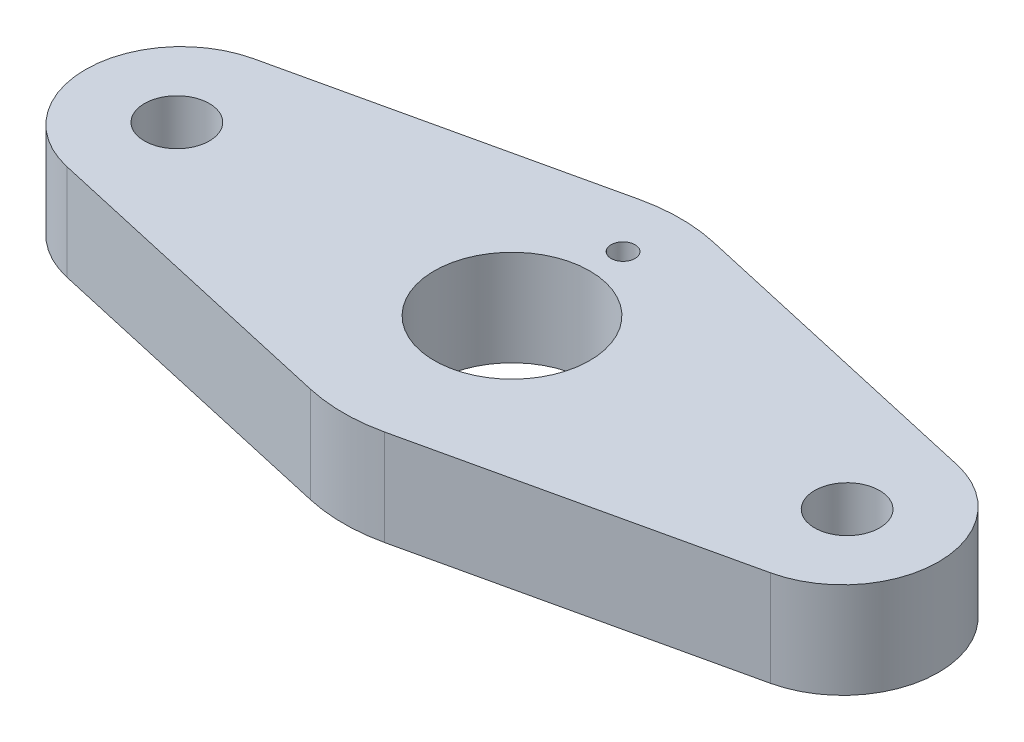
ISO-10303-21;
HEADER;
FILE_DESCRIPTION(('STEP AP214'),'2;1');
FILE_NAME('part.step','',(''),(''),'','','');
FILE_SCHEMA(('AUTOMOTIVE_DESIGN { 1 0 10303 214 1 1 1 1 }'));
ENDSEC;
DATA;
#1=APPLICATION_CONTEXT('core data for automotive mechanical design processes');
#2=APPLICATION_PROTOCOL_DEFINITION('international standard','automotive_design',2000,#1);
#3=PRODUCT_CONTEXT('',#1,'mechanical');
#4=PRODUCT('Part','Part','',(#3));
#5=PRODUCT_RELATED_PRODUCT_CATEGORY('part','',(#4));
#6=PRODUCT_DEFINITION_FORMATION('','',#4);
#7=PRODUCT_DEFINITION_CONTEXT('part definition',#1,'design');
#8=PRODUCT_DEFINITION('design','',#6,#7);
#9=PRODUCT_DEFINITION_SHAPE('','',#8);
#10=(LENGTH_UNIT() NAMED_UNIT(*) SI_UNIT(.MILLI.,.METRE.));
#11=(NAMED_UNIT(*) PLANE_ANGLE_UNIT() SI_UNIT($,.RADIAN.));
#12=(NAMED_UNIT(*) SI_UNIT($,.STERADIAN.) SOLID_ANGLE_UNIT());
#13=UNCERTAINTY_MEASURE_WITH_UNIT(LENGTH_MEASURE(1.E-05),#10,'distance_accuracy_value','');
#14=(GEOMETRIC_REPRESENTATION_CONTEXT(3) GLOBAL_UNCERTAINTY_ASSIGNED_CONTEXT((#13)) GLOBAL_UNIT_ASSIGNED_CONTEXT((#10,
#11,#12)) REPRESENTATION_CONTEXT('',''));
#15=CARTESIAN_POINT('',(0.,0.,0.));
#16=DIRECTION('',(0.,0.,1.));
#17=DIRECTION('',(1.,0.,0.));
#18=AXIS2_PLACEMENT_3D('',#15,#16,#17);
#19=CARTESIAN_POINT('',(21.9363636363636,0.,0.));
#20=DIRECTION('',(0.,1.,0.));
#21=DIRECTION('',(0.,0.,1.));
#22=AXIS2_PLACEMENT_3D('',#19,#20,#21);
#23=PLANE('',#22);
#24=CARTESIAN_POINT('',(22.225,0.,0.));
#25=DIRECTION('',(0.,-1.,0.));
#26=DIRECTION('',(0.,0.,-1.));
#27=AXIS2_PLACEMENT_3D('',#24,#25,#26);
#28=CIRCLE('',#27,2.15265000000001);
#29=CARTESIAN_POINT('',(22.225,0.,-2.15265000000001));
#30=VERTEX_POINT('',#29);
#31=EDGE_CURVE('E104',#30,#30,#28,.F.);
#32=ORIENTED_EDGE('',*,*,#31,.T.);
#33=EDGE_LOOP('',(#32));
#34=FACE_BOUND('',#33,.T.);
#35=CARTESIAN_POINT('',(-22.225,0.,0.));
#36=DIRECTION('',(0.,-1.,0.));
#37=DIRECTION('',(0.,0.,-1.));
#38=AXIS2_PLACEMENT_3D('',#35,#36,#37);
#39=CIRCLE('',#38,2.15265000000001);
#40=CARTESIAN_POINT('',(-22.225,0.,-2.15265000000001));
#41=VERTEX_POINT('',#40);
#42=EDGE_CURVE('E101',#41,#41,#39,.F.);
#43=ORIENTED_EDGE('',*,*,#42,.T.);
#44=EDGE_LOOP('',(#43));
#45=FACE_BOUND('',#44,.T.);
#46=DIRECTION('',(-0.975499871860576,0.,0.22));
#47=VECTOR('',#46,1.);
#48=CARTESIAN_POINT('',(23.3333636363632,0.,6.19442418631476));
#49=LINE('',#48,#47);
#50=CARTESIAN_POINT('',(23.3333636363634,0.,6.19442418631471));
#51=VERTEX_POINT('',#50);
#52=CARTESIAN_POINT('',(2.45872,0.,10.9021865679138));
#53=VERTEX_POINT('',#52);
#54=EDGE_CURVE('E84',#51,#53,#49,.T.);
#55=ORIENTED_EDGE('',*,*,#54,.T.);
#56=CARTESIAN_POINT('',(0.,0.,0.));
#57=DIRECTION('',(0.,-1.,0.));
#58=DIRECTION('',(0.,0.,-1.));
#59=AXIS2_PLACEMENT_3D('',#56,#57,#58);
#60=CIRCLE('',#59,11.176);
#61=CARTESIAN_POINT('',(-2.45872,0.,10.9021865679138));
#62=VERTEX_POINT('',#61);
#63=EDGE_CURVE('E112',#62,#53,#60,.F.);
#64=ORIENTED_EDGE('',*,*,#63,.F.);
#65=DIRECTION('',(-0.975499871860576,0.,-0.22));
#66=VECTOR('',#65,1.);
#67=CARTESIAN_POINT('',(-23.3333636363632,0.,6.19442418631476));
#68=LINE('',#67,#66);
#69=CARTESIAN_POINT('',(-23.3333636363634,0.,6.19442418631471));
#70=VERTEX_POINT('',#69);
#71=EDGE_CURVE('E109',#62,#70,#68,.T.);
#72=ORIENTED_EDGE('',*,*,#71,.T.);
#73=CARTESIAN_POINT('',(-21.9363636363636,0.,0.));
#74=DIRECTION('',(0.,-1.,0.));
#75=DIRECTION('',(0.,0.,-1.));
#76=AXIS2_PLACEMENT_3D('',#73,#74,#75);
#77=CIRCLE('',#76,6.35);
#78=CARTESIAN_POINT('',(-23.3333636363634,0.,-6.1944241863147));
#79=VERTEX_POINT('',#78);
#80=EDGE_CURVE('E117',#79,#70,#77,.F.);
#81=ORIENTED_EDGE('',*,*,#80,.F.);
#82=DIRECTION('',(0.975499871860576,0.,-0.22));
#83=VECTOR('',#82,1.);
#84=CARTESIAN_POINT('',(-23.3333636363632,0.,-6.19442418631475));
#85=LINE('',#84,#83);
#86=CARTESIAN_POINT('',(-2.45872,0.,-10.9021865679138));
#87=VERTEX_POINT('',#86);
#88=EDGE_CURVE('E114',#79,#87,#85,.T.);
#89=ORIENTED_EDGE('',*,*,#88,.T.);
#90=CARTESIAN_POINT('',(0.,0.,0.));
#91=DIRECTION('',(0.,-1.,0.));
#92=DIRECTION('',(0.,0.,-1.));
#93=AXIS2_PLACEMENT_3D('',#90,#91,#92);
#94=CIRCLE('',#93,11.176);
#95=CARTESIAN_POINT('',(2.45872,0.,-10.9021865679138));
#96=VERTEX_POINT('',#95);
#97=EDGE_CURVE('E148',#96,#87,#94,.F.);
#98=ORIENTED_EDGE('',*,*,#97,.F.);
#99=DIRECTION('',(0.975499871860576,0.,0.22));
#100=VECTOR('',#99,1.);
#101=CARTESIAN_POINT('',(23.3333636363632,0.,-6.19442418631475));
#102=LINE('',#101,#100);
#103=CARTESIAN_POINT('',(23.3333636363634,0.,-6.1944241863147));
#104=VERTEX_POINT('',#103);
#105=EDGE_CURVE('E86',#96,#104,#102,.T.);
#106=ORIENTED_EDGE('',*,*,#105,.T.);
#107=CARTESIAN_POINT('',(21.9363636363636,0.,0.));
#108=DIRECTION('',(0.,-1.,0.));
#109=DIRECTION('',(0.,0.,-1.));
#110=AXIS2_PLACEMENT_3D('',#107,#108,#109);
#111=CIRCLE('',#110,6.35);
#112=EDGE_CURVE('E80',#51,#104,#111,.F.);
#113=ORIENTED_EDGE('',*,*,#112,.F.);
#114=EDGE_LOOP('',(#55,#64,#72,#81,#89,#98,#106,#113));
#115=FACE_BOUND('',#114,.T.);
#116=CARTESIAN_POINT('',(0.,0.,0.));
#117=DIRECTION('',(0.,-1.,0.));
#118=DIRECTION('',(0.,0.,-1.));
#119=AXIS2_PLACEMENT_3D('',#116,#117,#118);
#120=CIRCLE('',#119,5.1562);
#121=CARTESIAN_POINT('',(0.,0.,-5.1562));
#122=VERTEX_POINT('',#121);
#123=EDGE_CURVE('E90',#122,#122,#120,.F.);
#124=ORIENTED_EDGE('',*,*,#123,.T.);
#125=EDGE_LOOP('',(#124));
#126=FACE_BOUND('',#125,.T.);
#127=CARTESIAN_POINT('',(0.,0.,-7.366));
#128=DIRECTION('',(0.,-1.,0.));
#129=DIRECTION('',(0.,0.,-1.));
#130=AXIS2_PLACEMENT_3D('',#127,#128,#129);
#131=CIRCLE('',#130,0.793749999999999);
#132=CARTESIAN_POINT('',(0.,0.,-8.15975));
#133=VERTEX_POINT('',#132);
#134=EDGE_CURVE('E20',#133,#133,#131,.F.);
#135=ORIENTED_EDGE('',*,*,#134,.T.);
#136=EDGE_LOOP('',(#135));
#137=FACE_BOUND('',#136,.T.);
#138=ADVANCED_FACE('F17',(#34,#45,#115,#126,#137),#23,.F.);
#139=CARTESIAN_POINT('',(0.,6.35,-7.366));
#140=DIRECTION('',(0.,-1.,0.));
#141=DIRECTION('',(0.,0.,-1.));
#142=AXIS2_PLACEMENT_3D('',#139,#140,#141);
#143=CYLINDRICAL_SURFACE('',#142,0.793749999999999);
#144=CARTESIAN_POINT('',(0.,6.35,-7.366));
#145=DIRECTION('',(0.,-1.,0.));
#146=DIRECTION('',(0.,0.,-1.));
#147=AXIS2_PLACEMENT_3D('',#144,#145,#146);
#148=CIRCLE('',#147,0.793749999999999);
#149=CARTESIAN_POINT('',(0.,6.35,-8.15975));
#150=VERTEX_POINT('',#149);
#151=EDGE_CURVE('E139',#150,#150,#148,.T.);
#152=ORIENTED_EDGE('',*,*,#151,.F.);
#153=EDGE_LOOP('',(#152));
#154=FACE_BOUND('',#153,.T.);
#155=ORIENTED_EDGE('',*,*,#134,.F.);
#156=EDGE_LOOP('',(#155));
#157=FACE_BOUND('',#156,.T.);
#158=ADVANCED_FACE('F155',(#154,#157),#143,.F.);
#159=CARTESIAN_POINT('',(0.,6.35,0.));
#160=DIRECTION('',(0.,-1.,0.));
#161=DIRECTION('',(0.,0.,-1.));
#162=AXIS2_PLACEMENT_3D('',#159,#160,#161);
#163=CYLINDRICAL_SURFACE('',#162,5.1562);
#164=CARTESIAN_POINT('',(0.,6.35,0.));
#165=DIRECTION('',(0.,-1.,0.));
#166=DIRECTION('',(0.,0.,-1.));
#167=AXIS2_PLACEMENT_3D('',#164,#165,#166);
#168=CIRCLE('',#167,5.1562);
#169=CARTESIAN_POINT('',(0.,6.35,-5.1562));
#170=VERTEX_POINT('',#169);
#171=EDGE_CURVE('E136',#170,#170,#168,.T.);
#172=ORIENTED_EDGE('',*,*,#171,.F.);
#173=EDGE_LOOP('',(#172));
#174=FACE_BOUND('',#173,.T.);
#175=ORIENTED_EDGE('',*,*,#123,.F.);
#176=EDGE_LOOP('',(#175));
#177=FACE_BOUND('',#176,.T.);
#178=ADVANCED_FACE('F157',(#174,#177),#163,.F.);
#179=CARTESIAN_POINT('',(21.9363636363636,6.35,0.));
#180=DIRECTION('',(0.,-1.,0.));
#181=DIRECTION('',(0.,0.,-1.));
#182=AXIS2_PLACEMENT_3D('',#179,#180,#181);
#183=CYLINDRICAL_SURFACE('',#182,6.35);
#184=CARTESIAN_POINT('',(21.9363636363636,6.35,0.));
#185=DIRECTION('',(0.,-1.,0.));
#186=DIRECTION('',(0.,0.,-1.));
#187=AXIS2_PLACEMENT_3D('',#184,#185,#186);
#188=CIRCLE('',#187,6.35);
#189=CARTESIAN_POINT('',(23.3333636363634,6.35,6.19442418631471));
#190=VERTEX_POINT('',#189);
#191=CARTESIAN_POINT('',(23.3333636363634,6.35,-6.1944241863147));
#192=VERTEX_POINT('',#191);
#193=EDGE_CURVE('E96',#190,#192,#188,.F.);
#194=ORIENTED_EDGE('',*,*,#193,.F.);
#195=DIRECTION('',(0.,1.,0.));
#196=VECTOR('',#195,1.);
#197=CARTESIAN_POINT('',(23.3333636363632,6.35,6.19442418631476));
#198=LINE('',#197,#196);
#199=EDGE_CURVE('E93',#190,#51,#198,.F.);
#200=ORIENTED_EDGE('',*,*,#199,.T.);
#201=ORIENTED_EDGE('',*,*,#112,.T.);
#202=DIRECTION('',(0.,1.,0.));
#203=VECTOR('',#202,1.);
#204=CARTESIAN_POINT('',(23.3333636363632,6.35,-6.19442418631475));
#205=LINE('',#204,#203);
#206=EDGE_CURVE('E89',#104,#192,#205,.T.);
#207=ORIENTED_EDGE('',*,*,#206,.T.);
#208=EDGE_LOOP('',(#194,#200,#201,#207));
#209=FACE_BOUND('',#208,.T.);
#210=ADVANCED_FACE('F94',(#209),#183,.T.);
#211=CARTESIAN_POINT('',(23.3333636363632,6.35,-6.19442418631475));
#212=DIRECTION('',(-0.22,0.,0.975499871860576));
#213=DIRECTION('',(0.975499871860576,0.,0.22));
#214=AXIS2_PLACEMENT_3D('',#211,#212,#213);
#215=PLANE('',#214);
#216=DIRECTION('',(0.,-1.,0.));
#217=VECTOR('',#216,1.);
#218=CARTESIAN_POINT('',(2.45872,6.35,-10.9021865679138));
#219=LINE('',#218,#217);
#220=CARTESIAN_POINT('',(2.45872,6.35,-10.9021865679138));
#221=VERTEX_POINT('',#220);
#222=EDGE_CURVE('E119',#221,#96,#219,.T.);
#223=ORIENTED_EDGE('',*,*,#222,.F.);
#224=DIRECTION('',(-0.975499871860576,0.,-0.22));
#225=VECTOR('',#224,1.);
#226=CARTESIAN_POINT('',(23.3333636363632,6.35,-6.19442418631475));
#227=LINE('',#226,#225);
#228=EDGE_CURVE('E134',#192,#221,#227,.T.);
#229=ORIENTED_EDGE('',*,*,#228,.F.);
#230=ORIENTED_EDGE('',*,*,#206,.F.);
#231=ORIENTED_EDGE('',*,*,#105,.F.);
#232=EDGE_LOOP('',(#223,#229,#230,#231));
#233=FACE_BOUND('',#232,.T.);
#234=ADVANCED_FACE('F204',(#233),#215,.F.);
#235=CARTESIAN_POINT('',(0.,6.35,0.));
#236=DIRECTION('',(0.,-1.,0.));
#237=DIRECTION('',(0.,0.,-1.));
#238=AXIS2_PLACEMENT_3D('',#235,#236,#237);
#239=CYLINDRICAL_SURFACE('',#238,11.176);
#240=ORIENTED_EDGE('',*,*,#97,.T.);
#241=DIRECTION('',(0.,1.,0.));
#242=VECTOR('',#241,1.);
#243=CARTESIAN_POINT('',(-2.45872,6.35,-10.9021865679138));
#244=LINE('',#243,#242);
#245=CARTESIAN_POINT('',(-2.45872,6.35,-10.9021865679138));
#246=VERTEX_POINT('',#245);
#247=EDGE_CURVE('E118',#87,#246,#244,.T.);
#248=ORIENTED_EDGE('',*,*,#247,.T.);
#249=CARTESIAN_POINT('',(0.,6.35,0.));
#250=DIRECTION('',(0.,-1.,0.));
#251=DIRECTION('',(0.,0.,-1.));
#252=AXIS2_PLACEMENT_3D('',#249,#250,#251);
#253=CIRCLE('',#252,11.176);
#254=EDGE_CURVE('E132',#221,#246,#253,.F.);
#255=ORIENTED_EDGE('',*,*,#254,.F.);
#256=ORIENTED_EDGE('',*,*,#222,.T.);
#257=EDGE_LOOP('',(#240,#248,#255,#256));
#258=FACE_BOUND('',#257,.T.);
#259=ADVANCED_FACE('F200',(#258),#239,.T.);
#260=CARTESIAN_POINT('',(-23.3333636363632,6.35,-6.19442418631475));
#261=DIRECTION('',(0.22,0.,0.975499871860576));
#262=DIRECTION('',(0.975499871860576,0.,-0.22));
#263=AXIS2_PLACEMENT_3D('',#260,#261,#262);
#264=PLANE('',#263);
#265=DIRECTION('',(0.,-1.,0.));
#266=VECTOR('',#265,1.);
#267=CARTESIAN_POINT('',(-23.3333636363632,6.35,-6.19442418631475));
#268=LINE('',#267,#266);
#269=CARTESIAN_POINT('',(-23.3333636363634,6.35,-6.1944241863147));
#270=VERTEX_POINT('',#269);
#271=EDGE_CURVE('E147',#270,#79,#268,.T.);
#272=ORIENTED_EDGE('',*,*,#271,.F.);
#273=DIRECTION('',(-0.975499871860576,0.,0.22));
#274=VECTOR('',#273,1.);
#275=CARTESIAN_POINT('',(-2.45872,6.35,-10.9021865679138));
#276=LINE('',#275,#274);
#277=EDGE_CURVE('E131',#246,#270,#276,.T.);
#278=ORIENTED_EDGE('',*,*,#277,.F.);
#279=ORIENTED_EDGE('',*,*,#247,.F.);
#280=ORIENTED_EDGE('',*,*,#88,.F.);
#281=EDGE_LOOP('',(#272,#278,#279,#280));
#282=FACE_BOUND('',#281,.T.);
#283=ADVANCED_FACE('F196',(#282),#264,.F.);
#284=CARTESIAN_POINT('',(-21.9363636363636,6.35,0.));
#285=DIRECTION('',(0.,-1.,0.));
#286=DIRECTION('',(0.,0.,-1.));
#287=AXIS2_PLACEMENT_3D('',#284,#285,#286);
#288=CYLINDRICAL_SURFACE('',#287,6.35);
#289=CARTESIAN_POINT('',(-21.9363636363636,6.35,0.));
#290=DIRECTION('',(0.,-1.,0.));
#291=DIRECTION('',(0.,0.,-1.));
#292=AXIS2_PLACEMENT_3D('',#289,#290,#291);
#293=CIRCLE('',#292,6.35);
#294=CARTESIAN_POINT('',(-23.3333636363634,6.35,6.19442418631471));
#295=VERTEX_POINT('',#294);
#296=EDGE_CURVE('E128',#270,#295,#293,.F.);
#297=ORIENTED_EDGE('',*,*,#296,.F.);
#298=ORIENTED_EDGE('',*,*,#271,.T.);
#299=ORIENTED_EDGE('',*,*,#80,.T.);
#300=DIRECTION('',(0.,1.,0.));
#301=VECTOR('',#300,1.);
#302=CARTESIAN_POINT('',(-23.3333636363632,6.35,6.19442418631476));
#303=LINE('',#302,#301);
#304=EDGE_CURVE('E113',#70,#295,#303,.T.);
#305=ORIENTED_EDGE('',*,*,#304,.T.);
#306=EDGE_LOOP('',(#297,#298,#299,#305));
#307=FACE_BOUND('',#306,.T.);
#308=ADVANCED_FACE('F192',(#307),#288,.T.);
#309=CARTESIAN_POINT('',(-23.3333636363632,6.35,6.19442418631476));
#310=DIRECTION('',(0.22,0.,-0.975499871860576));
#311=DIRECTION('',(-0.975499871860576,0.,-0.22));
#312=AXIS2_PLACEMENT_3D('',#309,#310,#311);
#313=PLANE('',#312);
#314=DIRECTION('',(0.,-1.,0.));
#315=VECTOR('',#314,1.);
#316=CARTESIAN_POINT('',(-2.45872,6.35,10.9021865679138));
#317=LINE('',#316,#315);
#318=CARTESIAN_POINT('',(-2.45872,6.35,10.9021865679138));
#319=VERTEX_POINT('',#318);
#320=EDGE_CURVE('E145',#319,#62,#317,.T.);
#321=ORIENTED_EDGE('',*,*,#320,.F.);
#322=DIRECTION('',(0.975499871860576,0.,0.22));
#323=VECTOR('',#322,1.);
#324=CARTESIAN_POINT('',(-23.3333636363632,6.35,6.19442418631476));
#325=LINE('',#324,#323);
#326=EDGE_CURVE('E127',#295,#319,#325,.T.);
#327=ORIENTED_EDGE('',*,*,#326,.F.);
#328=ORIENTED_EDGE('',*,*,#304,.F.);
#329=ORIENTED_EDGE('',*,*,#71,.F.);
#330=EDGE_LOOP('',(#321,#327,#328,#329));
#331=FACE_BOUND('',#330,.T.);
#332=ADVANCED_FACE('F189',(#331),#313,.F.);
#333=CARTESIAN_POINT('',(0.,6.35,0.));
#334=DIRECTION('',(0.,-1.,0.));
#335=DIRECTION('',(0.,0.,-1.));
#336=AXIS2_PLACEMENT_3D('',#333,#334,#335);
#337=CYLINDRICAL_SURFACE('',#336,11.176);
#338=CARTESIAN_POINT('',(0.,6.35,0.));
#339=DIRECTION('',(0.,-1.,0.));
#340=DIRECTION('',(0.,0.,-1.));
#341=AXIS2_PLACEMENT_3D('',#338,#339,#340);
#342=CIRCLE('',#341,11.176);
#343=CARTESIAN_POINT('',(2.45872,6.35,10.9021865679138));
#344=VERTEX_POINT('',#343);
#345=EDGE_CURVE('E124',#319,#344,#342,.F.);
#346=ORIENTED_EDGE('',*,*,#345,.F.);
#347=ORIENTED_EDGE('',*,*,#320,.T.);
#348=ORIENTED_EDGE('',*,*,#63,.T.);
#349=DIRECTION('',(0.,1.,0.));
#350=VECTOR('',#349,1.);
#351=CARTESIAN_POINT('',(2.45872,6.35,10.9021865679138));
#352=LINE('',#351,#350);
#353=EDGE_CURVE('E35',#53,#344,#352,.T.);
#354=ORIENTED_EDGE('',*,*,#353,.T.);
#355=EDGE_LOOP('',(#346,#347,#348,#354));
#356=FACE_BOUND('',#355,.T.);
#357=ADVANCED_FACE('F186',(#356),#337,.T.);
#358=CARTESIAN_POINT('',(23.3333636363632,6.35,6.19442418631476));
#359=DIRECTION('',(-0.22,0.,-0.975499871860576));
#360=DIRECTION('',(-0.975499871860576,0.,0.22));
#361=AXIS2_PLACEMENT_3D('',#358,#359,#360);
#362=PLANE('',#361);
#363=ORIENTED_EDGE('',*,*,#199,.F.);
#364=DIRECTION('',(0.975499871860576,0.,-0.22));
#365=VECTOR('',#364,1.);
#366=CARTESIAN_POINT('',(2.45872,6.35,10.9021865679138));
#367=LINE('',#366,#365);
#368=EDGE_CURVE('E123',#344,#190,#367,.T.);
#369=ORIENTED_EDGE('',*,*,#368,.F.);
#370=ORIENTED_EDGE('',*,*,#353,.F.);
#371=ORIENTED_EDGE('',*,*,#54,.F.);
#372=EDGE_LOOP('',(#363,#369,#370,#371));
#373=FACE_BOUND('',#372,.T.);
#374=ADVANCED_FACE('F100',(#373),#362,.F.);
#375=CARTESIAN_POINT('',(-22.225,6.35,0.));
#376=DIRECTION('',(0.,-1.,0.));
#377=DIRECTION('',(0.,0.,-1.));
#378=AXIS2_PLACEMENT_3D('',#375,#376,#377);
#379=CYLINDRICAL_SURFACE('',#378,2.15265000000001);
#380=CARTESIAN_POINT('',(-22.225,6.35,0.));
#381=DIRECTION('',(0.,-1.,0.));
#382=DIRECTION('',(0.,0.,-1.));
#383=AXIS2_PLACEMENT_3D('',#380,#381,#382);
#384=CIRCLE('',#383,2.15265000000001);
#385=CARTESIAN_POINT('',(-22.225,6.35,-2.15265000000001));
#386=VERTEX_POINT('',#385);
#387=EDGE_CURVE('E26',#386,#386,#384,.T.);
#388=ORIENTED_EDGE('',*,*,#387,.F.);
#389=EDGE_LOOP('',(#388));
#390=FACE_BOUND('',#389,.T.);
#391=ORIENTED_EDGE('',*,*,#42,.F.);
#392=EDGE_LOOP('',(#391));
#393=FACE_BOUND('',#392,.T.);
#394=ADVANCED_FACE('F176',(#390,#393),#379,.F.);
#395=CARTESIAN_POINT('',(22.225,6.35,0.));
#396=DIRECTION('',(0.,-1.,0.));
#397=DIRECTION('',(0.,0.,-1.));
#398=AXIS2_PLACEMENT_3D('',#395,#396,#397);
#399=CYLINDRICAL_SURFACE('',#398,2.15265000000001);
#400=CARTESIAN_POINT('',(22.225,6.35,0.));
#401=DIRECTION('',(0.,-1.,0.));
#402=DIRECTION('',(0.,0.,-1.));
#403=AXIS2_PLACEMENT_3D('',#400,#401,#402);
#404=CIRCLE('',#403,2.15265000000001);
#405=CARTESIAN_POINT('',(22.225,6.35,-2.15265000000001));
#406=VERTEX_POINT('',#405);
#407=EDGE_CURVE('E11',#406,#406,#404,.T.);
#408=ORIENTED_EDGE('',*,*,#407,.F.);
#409=EDGE_LOOP('',(#408));
#410=FACE_BOUND('',#409,.T.);
#411=ORIENTED_EDGE('',*,*,#31,.F.);
#412=EDGE_LOOP('',(#411));
#413=FACE_BOUND('',#412,.T.);
#414=ADVANCED_FACE('F170',(#410,#413),#399,.F.);
#415=CARTESIAN_POINT('',(21.9363636363636,6.35,0.));
#416=DIRECTION('',(0.,1.,0.));
#417=DIRECTION('',(0.,0.,1.));
#418=AXIS2_PLACEMENT_3D('',#415,#416,#417);
#419=PLANE('',#418);
#420=ORIENTED_EDGE('',*,*,#407,.T.);
#421=EDGE_LOOP('',(#420));
#422=FACE_BOUND('',#421,.T.);
#423=ORIENTED_EDGE('',*,*,#387,.T.);
#424=EDGE_LOOP('',(#423));
#425=FACE_BOUND('',#424,.T.);
#426=ORIENTED_EDGE('',*,*,#345,.T.);
#427=ORIENTED_EDGE('',*,*,#368,.T.);
#428=ORIENTED_EDGE('',*,*,#193,.T.);
#429=ORIENTED_EDGE('',*,*,#228,.T.);
#430=ORIENTED_EDGE('',*,*,#254,.T.);
#431=ORIENTED_EDGE('',*,*,#277,.T.);
#432=ORIENTED_EDGE('',*,*,#296,.T.);
#433=ORIENTED_EDGE('',*,*,#326,.T.);
#434=EDGE_LOOP('',(#426,#427,#428,#429,#430,#431,#432,#433));
#435=FACE_BOUND('',#434,.T.);
#436=ORIENTED_EDGE('',*,*,#171,.T.);
#437=EDGE_LOOP('',(#436));
#438=FACE_BOUND('',#437,.T.);
#439=ORIENTED_EDGE('',*,*,#151,.T.);
#440=EDGE_LOOP('',(#439));
#441=FACE_BOUND('',#440,.T.);
#442=ADVANCED_FACE('F168',(#422,#425,#435,#438,#441),#419,.T.);
#443=CLOSED_SHELL('',(#138,#158,#178,#210,#234,#259,#283,#308,#332,#357,#374,#394,#414,#442));
#444=MANIFOLD_SOLID_BREP('B1',#443);
#445=ADVANCED_BREP_SHAPE_REPRESENTATION('',(#18,#444),#14);
#446=SHAPE_DEFINITION_REPRESENTATION(#9,#445);
ENDSEC;
END-ISO-10303-21;
